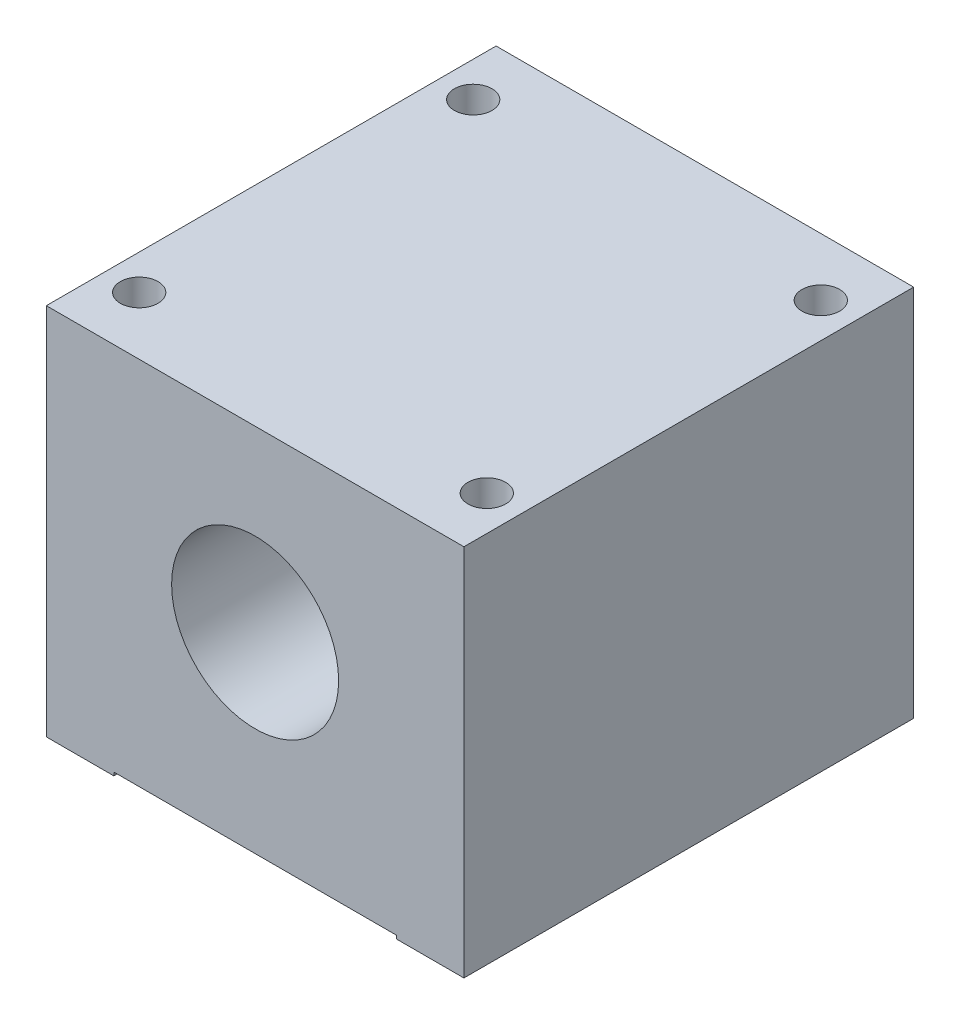
ISO-10303-21;
HEADER;
FILE_DESCRIPTION(('STEP AP214'),'2;1');
FILE_NAME('part.step','',(''),(''),'','','');
FILE_SCHEMA(('AUTOMOTIVE_DESIGN { 1 0 10303 214 1 1 1 1 }'));
ENDSEC;
DATA;
#1=APPLICATION_CONTEXT('core data for automotive mechanical design processes');
#2=APPLICATION_PROTOCOL_DEFINITION('international standard','automotive_design',2000,#1);
#3=PRODUCT_CONTEXT('',#1,'mechanical');
#4=PRODUCT('Part','Part','',(#3));
#5=PRODUCT_RELATED_PRODUCT_CATEGORY('part','',(#4));
#6=PRODUCT_DEFINITION_FORMATION('','',#4);
#7=PRODUCT_DEFINITION_CONTEXT('part definition',#1,'design');
#8=PRODUCT_DEFINITION('design','',#6,#7);
#9=PRODUCT_DEFINITION_SHAPE('','',#8);
#10=(LENGTH_UNIT() NAMED_UNIT(*) SI_UNIT(.MILLI.,.METRE.));
#11=(NAMED_UNIT(*) PLANE_ANGLE_UNIT() SI_UNIT($,.RADIAN.));
#12=(NAMED_UNIT(*) SI_UNIT($,.STERADIAN.) SOLID_ANGLE_UNIT());
#13=UNCERTAINTY_MEASURE_WITH_UNIT(LENGTH_MEASURE(1.E-05),#10,'distance_accuracy_value','');
#14=(GEOMETRIC_REPRESENTATION_CONTEXT(3) GLOBAL_UNCERTAINTY_ASSIGNED_CONTEXT((#13)) GLOBAL_UNIT_ASSIGNED_CONTEXT((#10,
#11,#12)) REPRESENTATION_CONTEXT('',''));
#15=CARTESIAN_POINT('',(0.,0.,0.));
#16=DIRECTION('',(0.,0.,1.));
#17=DIRECTION('',(1.,0.,0.));
#18=AXIS2_PLACEMENT_3D('',#15,#16,#17);
#19=CARTESIAN_POINT('',(0.,0.,0.));
#20=DIRECTION('',(0.,1.,0.));
#21=DIRECTION('',(0.,0.,1.));
#22=AXIS2_PLACEMENT_3D('',#19,#20,#21);
#23=PLANE('',#22);
#24=CARTESIAN_POINT('',(-26.8975,0.,6.78260869565217));
#25=DIRECTION('',(0.,1.,0.));
#26=DIRECTION('',(0.,0.,1.));
#27=AXIS2_PLACEMENT_3D('',#24,#25,#26);
#28=CIRCLE('',#27,2.15);
#29=CARTESIAN_POINT('',(-26.8975,0.,8.93260869565217));
#30=VERTEX_POINT('',#29);
#31=EDGE_CURVE('E172',#30,#30,#28,.T.);
#32=ORIENTED_EDGE('',*,*,#31,.T.);
#33=EDGE_LOOP('',(#32));
#34=FACE_BOUND('',#33,.T.);
#35=CARTESIAN_POINT('',(-26.8975,0.,-31.3173913043478));
#36=DIRECTION('',(0.,1.,0.));
#37=DIRECTION('',(0.,0.,1.));
#38=AXIS2_PLACEMENT_3D('',#35,#36,#37);
#39=CIRCLE('',#38,2.15);
#40=CARTESIAN_POINT('',(-26.8975,0.,-29.1673913043478));
#41=VERTEX_POINT('',#40);
#42=EDGE_CURVE('E184',#41,#41,#39,.T.);
#43=ORIENTED_EDGE('',*,*,#42,.T.);
#44=EDGE_LOOP('',(#43));
#45=FACE_BOUND('',#44,.T.);
#46=DIRECTION('',(1.,0.,0.));
#47=VECTOR('',#46,1.);
#48=CARTESIAN_POINT('',(-70.5375,0.,13.3826086956522));
#49=LINE('',#48,#47);
#50=CARTESIAN_POINT('',(-30.6075,0.,13.3826086956522));
#51=VERTEX_POINT('',#50);
#52=CARTESIAN_POINT('',(-22.9075,0.,13.3826086956522));
#53=VERTEX_POINT('',#52);
#54=EDGE_CURVE('E76',#51,#53,#49,.T.);
#55=ORIENTED_EDGE('',*,*,#54,.F.);
#56=DIRECTION('',(0.,0.,1.));
#57=VECTOR('',#56,1.);
#58=CARTESIAN_POINT('',(-30.6075,0.,17.1604271001959));
#59=LINE('',#58,#57);
#60=CARTESIAN_POINT('',(-30.6075,0.,-37.9173913043478));
#61=VERTEX_POINT('',#60);
#62=EDGE_CURVE('E108',#61,#51,#59,.T.);
#63=ORIENTED_EDGE('',*,*,#62,.F.);
#64=DIRECTION('',(-1.,0.,0.));
#65=VECTOR('',#64,1.);
#66=CARTESIAN_POINT('',(-70.5375,0.,-37.9173913043478));
#67=LINE('',#66,#65);
#68=CARTESIAN_POINT('',(-22.9075,0.,-37.9173913043478));
#69=VERTEX_POINT('',#68);
#70=EDGE_CURVE('E116',#69,#61,#67,.T.);
#71=ORIENTED_EDGE('',*,*,#70,.F.);
#72=DIRECTION('',(0.,0.,-1.));
#73=VECTOR('',#72,1.);
#74=CARTESIAN_POINT('',(-22.9075,0.,-37.9173913043478));
#75=LINE('',#74,#73);
#76=EDGE_CURVE('E128',#53,#69,#75,.T.);
#77=ORIENTED_EDGE('',*,*,#76,.F.);
#78=EDGE_LOOP('',(#55,#63,#71,#77));
#79=FACE_BOUND('',#78,.T.);
#80=ADVANCED_FACE('F32',(#34,#45,#79),#23,.F.);
#81=CARTESIAN_POINT('',(0.,42.6,0.));
#82=DIRECTION('',(0.,1.,0.));
#83=DIRECTION('',(0.,0.,1.));
#84=AXIS2_PLACEMENT_3D('',#81,#82,#83);
#85=PLANE('',#84);
#86=CARTESIAN_POINT('',(-66.5475,42.6,6.78260869565217));
#87=DIRECTION('',(0.,1.,0.));
#88=DIRECTION('',(0.,0.,1.));
#89=AXIS2_PLACEMENT_3D('',#86,#87,#88);
#90=CIRCLE('',#89,2.15);
#91=CARTESIAN_POINT('',(-66.5475,42.6,8.93260869565217));
#92=VERTEX_POINT('',#91);
#93=EDGE_CURVE('E181',#92,#92,#90,.T.);
#94=ORIENTED_EDGE('',*,*,#93,.F.);
#95=EDGE_LOOP('',(#94));
#96=FACE_BOUND('',#95,.T.);
#97=CARTESIAN_POINT('',(-66.5475,42.6,-31.3173913043478));
#98=DIRECTION('',(0.,1.,0.));
#99=DIRECTION('',(0.,0.,1.));
#100=AXIS2_PLACEMENT_3D('',#97,#98,#99);
#101=CIRCLE('',#100,2.15);
#102=CARTESIAN_POINT('',(-66.5475,42.6,-29.1673913043478));
#103=VERTEX_POINT('',#102);
#104=EDGE_CURVE('E193',#103,#103,#101,.T.);
#105=ORIENTED_EDGE('',*,*,#104,.F.);
#106=EDGE_LOOP('',(#105));
#107=FACE_BOUND('',#106,.T.);
#108=DIRECTION('',(0.,0.,-1.));
#109=VECTOR('',#108,1.);
#110=CARTESIAN_POINT('',(-22.9075,42.6,-37.9173913043478));
#111=LINE('',#110,#109);
#112=CARTESIAN_POINT('',(-22.9075,42.6,13.3826086956522));
#113=VERTEX_POINT('',#112);
#114=CARTESIAN_POINT('',(-22.9075,42.6,-37.9173913043478));
#115=VERTEX_POINT('',#114);
#116=EDGE_CURVE('E135',#113,#115,#111,.T.);
#117=ORIENTED_EDGE('',*,*,#116,.T.);
#118=DIRECTION('',(-1.,0.,0.));
#119=VECTOR('',#118,1.);
#120=CARTESIAN_POINT('',(-70.5375,42.6,-37.9173913043478));
#121=LINE('',#120,#119);
#122=CARTESIAN_POINT('',(-70.5375,42.6,-37.9173913043478));
#123=VERTEX_POINT('',#122);
#124=EDGE_CURVE('E84',#115,#123,#121,.T.);
#125=ORIENTED_EDGE('',*,*,#124,.T.);
#126=DIRECTION('',(0.,0.,1.));
#127=VECTOR('',#126,1.);
#128=CARTESIAN_POINT('',(-70.5375,42.6,-37.9173913043478));
#129=LINE('',#128,#127);
#130=CARTESIAN_POINT('',(-70.5375,42.6,13.3826086956522));
#131=VERTEX_POINT('',#130);
#132=EDGE_CURVE('E200',#123,#131,#129,.T.);
#133=ORIENTED_EDGE('',*,*,#132,.T.);
#134=DIRECTION('',(1.,0.,0.));
#135=VECTOR('',#134,1.);
#136=CARTESIAN_POINT('',(-70.5375,42.6,13.3826086956522));
#137=LINE('',#136,#135);
#138=EDGE_CURVE('E56',#131,#113,#137,.T.);
#139=ORIENTED_EDGE('',*,*,#138,.T.);
#140=EDGE_LOOP('',(#117,#125,#133,#139));
#141=FACE_BOUND('',#140,.T.);
#142=CARTESIAN_POINT('',(-26.8975,42.6,-31.3173913043478));
#143=DIRECTION('',(0.,1.,0.));
#144=DIRECTION('',(0.,0.,1.));
#145=AXIS2_PLACEMENT_3D('',#142,#143,#144);
#146=CIRCLE('',#145,2.15);
#147=CARTESIAN_POINT('',(-26.8975,42.6,-29.1673913043478));
#148=VERTEX_POINT('',#147);
#149=EDGE_CURVE('E187',#148,#148,#146,.T.);
#150=ORIENTED_EDGE('',*,*,#149,.F.);
#151=EDGE_LOOP('',(#150));
#152=FACE_BOUND('',#151,.T.);
#153=CARTESIAN_POINT('',(-26.8975,42.6,6.78260869565217));
#154=DIRECTION('',(0.,1.,0.));
#155=DIRECTION('',(0.,0.,1.));
#156=AXIS2_PLACEMENT_3D('',#153,#154,#155);
#157=CIRCLE('',#156,2.15);
#158=CARTESIAN_POINT('',(-26.8975,42.6,8.93260869565217));
#159=VERTEX_POINT('',#158);
#160=EDGE_CURVE('E175',#159,#159,#157,.T.);
#161=ORIENTED_EDGE('',*,*,#160,.F.);
#162=EDGE_LOOP('',(#161));
#163=FACE_BOUND('',#162,.T.);
#164=ADVANCED_FACE('F203',(#96,#107,#141,#152,#163),#85,.T.);
#165=CARTESIAN_POINT('',(-62.8375,0.,-37.9173913043478));
#166=VERTEX_POINT('',#165);
#167=CARTESIAN_POINT('',(-70.5375,0.,-37.9173913043478));
#168=VERTEX_POINT('',#167);
#169=EDGE_CURVE('E125',#166,#168,#67,.T.);
#170=ORIENTED_EDGE('',*,*,#169,.F.);
#171=DIRECTION('',(0.,0.,-1.));
#172=VECTOR('',#171,1.);
#173=CARTESIAN_POINT('',(-62.8375,0.,17.1604271001959));
#174=LINE('',#173,#172);
#175=CARTESIAN_POINT('',(-62.8375,0.,13.3826086956522));
#176=VERTEX_POINT('',#175);
#177=EDGE_CURVE('E117',#176,#166,#174,.T.);
#178=ORIENTED_EDGE('',*,*,#177,.F.);
#179=CARTESIAN_POINT('',(-70.5375,0.,13.3826086956522));
#180=VERTEX_POINT('',#179);
#181=EDGE_CURVE('E132',#180,#176,#49,.T.);
#182=ORIENTED_EDGE('',*,*,#181,.F.);
#183=DIRECTION('',(0.,0.,1.));
#184=VECTOR('',#183,1.);
#185=CARTESIAN_POINT('',(-70.5375,0.,-37.9173913043478));
#186=LINE('',#185,#184);
#187=EDGE_CURVE('E124',#168,#180,#186,.T.);
#188=ORIENTED_EDGE('',*,*,#187,.F.);
#189=EDGE_LOOP('',(#170,#178,#182,#188));
#190=FACE_BOUND('',#189,.T.);
#191=CARTESIAN_POINT('',(-66.5475,0.,-31.3173913043478));
#192=DIRECTION('',(0.,1.,0.));
#193=DIRECTION('',(0.,0.,1.));
#194=AXIS2_PLACEMENT_3D('',#191,#192,#193);
#195=CIRCLE('',#194,2.15);
#196=CARTESIAN_POINT('',(-66.5475,0.,-29.1673913043478));
#197=VERTEX_POINT('',#196);
#198=EDGE_CURVE('E190',#197,#197,#195,.T.);
#199=ORIENTED_EDGE('',*,*,#198,.T.);
#200=EDGE_LOOP('',(#199));
#201=FACE_BOUND('',#200,.T.);
#202=CARTESIAN_POINT('',(-66.5475,0.,6.78260869565217));
#203=DIRECTION('',(0.,1.,0.));
#204=DIRECTION('',(0.,0.,1.));
#205=AXIS2_PLACEMENT_3D('',#202,#203,#204);
#206=CIRCLE('',#205,2.15);
#207=CARTESIAN_POINT('',(-66.5475,0.,8.93260869565217));
#208=VERTEX_POINT('',#207);
#209=EDGE_CURVE('E178',#208,#208,#206,.T.);
#210=ORIENTED_EDGE('',*,*,#209,.T.);
#211=EDGE_LOOP('',(#210));
#212=FACE_BOUND('',#211,.T.);
#213=ADVANCED_FACE('F159',(#190,#201,#212),#23,.F.);
#214=CARTESIAN_POINT('',(-22.9075,42.6,-37.9173913043478));
#215=DIRECTION('',(-1.,0.,0.));
#216=DIRECTION('',(0.,0.,1.));
#217=AXIS2_PLACEMENT_3D('',#214,#215,#216);
#218=PLANE('',#217);
#219=ORIENTED_EDGE('',*,*,#76,.T.);
#220=DIRECTION('',(0.,-1.,0.));
#221=VECTOR('',#220,1.);
#222=CARTESIAN_POINT('',(-22.9075,42.6,-37.9173913043478));
#223=LINE('',#222,#221);
#224=EDGE_CURVE('E122',#115,#69,#223,.T.);
#225=ORIENTED_EDGE('',*,*,#224,.F.);
#226=ORIENTED_EDGE('',*,*,#116,.F.);
#227=DIRECTION('',(0.,-1.,0.));
#228=VECTOR('',#227,1.);
#229=CARTESIAN_POINT('',(-22.9075,42.6,13.3826086956522));
#230=LINE('',#229,#228);
#231=EDGE_CURVE('E136',#113,#53,#230,.T.);
#232=ORIENTED_EDGE('',*,*,#231,.T.);
#233=EDGE_LOOP('',(#219,#225,#226,#232));
#234=FACE_BOUND('',#233,.T.);
#235=ADVANCED_FACE('F34',(#234),#218,.F.);
#236=CARTESIAN_POINT('',(-70.5375,42.6,-37.9173913043478));
#237=DIRECTION('',(0.,0.,1.));
#238=DIRECTION('',(1.,0.,0.));
#239=AXIS2_PLACEMENT_3D('',#236,#237,#238);
#240=PLANE('',#239);
#241=ORIENTED_EDGE('',*,*,#70,.T.);
#242=DIRECTION('',(0.,1.,0.));
#243=VECTOR('',#242,1.);
#244=CARTESIAN_POINT('',(-30.6075,42.6,-37.9173913043478));
#245=LINE('',#244,#243);
#246=CARTESIAN_POINT('',(-30.6075,0.38,-37.9173913043478));
#247=VERTEX_POINT('',#246);
#248=EDGE_CURVE('E105',#61,#247,#245,.T.);
#249=ORIENTED_EDGE('',*,*,#248,.T.);
#250=DIRECTION('',(1.,0.,0.));
#251=VECTOR('',#250,1.);
#252=CARTESIAN_POINT('',(-70.5375,0.379999999999998,-37.9173913043478));
#253=LINE('',#252,#251);
#254=CARTESIAN_POINT('',(-62.8375,0.38,-37.9173913043478));
#255=VERTEX_POINT('',#254);
#256=EDGE_CURVE('E166',#255,#247,#253,.T.);
#257=ORIENTED_EDGE('',*,*,#256,.F.);
#258=DIRECTION('',(0.,-1.,0.));
#259=VECTOR('',#258,1.);
#260=CARTESIAN_POINT('',(-62.8375,42.6,-37.9173913043478));
#261=LINE('',#260,#259);
#262=EDGE_CURVE('E112',#255,#166,#261,.T.);
#263=ORIENTED_EDGE('',*,*,#262,.T.);
#264=ORIENTED_EDGE('',*,*,#169,.T.);
#265=DIRECTION('',(0.,-1.,0.));
#266=VECTOR('',#265,1.);
#267=CARTESIAN_POINT('',(-70.5375,42.6,-37.9173913043478));
#268=LINE('',#267,#266);
#269=EDGE_CURVE('E141',#123,#168,#268,.T.);
#270=ORIENTED_EDGE('',*,*,#269,.F.);
#271=ORIENTED_EDGE('',*,*,#124,.F.);
#272=ORIENTED_EDGE('',*,*,#224,.T.);
#273=EDGE_LOOP('',(#241,#249,#257,#263,#264,#270,#271,#272));
#274=FACE_BOUND('',#273,.T.);
#275=CARTESIAN_POINT('',(-46.7225,22.23,-37.9173913043478));
#276=DIRECTION('',(0.,0.,1.));
#277=DIRECTION('',(1.,0.,0.));
#278=AXIS2_PLACEMENT_3D('',#275,#276,#277);
#279=CIRCLE('',#278,9.525);
#280=CARTESIAN_POINT('',(-37.1975,22.23,-37.9173913043478));
#281=VERTEX_POINT('',#280);
#282=EDGE_CURVE('E169',#281,#281,#279,.T.);
#283=ORIENTED_EDGE('',*,*,#282,.T.);
#284=EDGE_LOOP('',(#283));
#285=FACE_BOUND('',#284,.T.);
#286=ADVANCED_FACE('F119',(#274,#285),#240,.F.);
#287=CARTESIAN_POINT('',(-70.5375,42.6,-37.9173913043478));
#288=DIRECTION('',(1.,0.,0.));
#289=DIRECTION('',(0.,0.,-1.));
#290=AXIS2_PLACEMENT_3D('',#287,#288,#289);
#291=PLANE('',#290);
#292=ORIENTED_EDGE('',*,*,#187,.T.);
#293=DIRECTION('',(0.,-1.,0.));
#294=VECTOR('',#293,1.);
#295=CARTESIAN_POINT('',(-70.5375,42.6,13.3826086956522));
#296=LINE('',#295,#294);
#297=EDGE_CURVE('E138',#131,#180,#296,.T.);
#298=ORIENTED_EDGE('',*,*,#297,.F.);
#299=ORIENTED_EDGE('',*,*,#132,.F.);
#300=ORIENTED_EDGE('',*,*,#269,.T.);
#301=EDGE_LOOP('',(#292,#298,#299,#300));
#302=FACE_BOUND('',#301,.T.);
#303=ADVANCED_FACE('F206',(#302),#291,.F.);
#304=CARTESIAN_POINT('',(-70.5375,42.6,13.3826086956522));
#305=DIRECTION('',(0.,0.,-1.));
#306=DIRECTION('',(-1.,0.,0.));
#307=AXIS2_PLACEMENT_3D('',#304,#305,#306);
#308=PLANE('',#307);
#309=CARTESIAN_POINT('',(-46.7225,22.23,13.3826086956522));
#310=DIRECTION('',(0.,0.,1.));
#311=DIRECTION('',(1.,0.,0.));
#312=AXIS2_PLACEMENT_3D('',#309,#310,#311);
#313=CIRCLE('',#312,9.525);
#314=CARTESIAN_POINT('',(-37.1975,22.23,13.3826086956522));
#315=VERTEX_POINT('',#314);
#316=EDGE_CURVE('E111',#315,#315,#313,.T.);
#317=ORIENTED_EDGE('',*,*,#316,.F.);
#318=EDGE_LOOP('',(#317));
#319=FACE_BOUND('',#318,.T.);
#320=DIRECTION('',(-1.,0.,0.));
#321=VECTOR('',#320,1.);
#322=CARTESIAN_POINT('',(-70.5375,0.379999999999998,13.3826086956522));
#323=LINE('',#322,#321);
#324=CARTESIAN_POINT('',(-30.6075,0.379999999999998,13.3826086956522));
#325=VERTEX_POINT('',#324);
#326=CARTESIAN_POINT('',(-62.8375,0.38,13.3826086956522));
#327=VERTEX_POINT('',#326);
#328=EDGE_CURVE('E145',#325,#327,#323,.T.);
#329=ORIENTED_EDGE('',*,*,#328,.F.);
#330=DIRECTION('',(0.,-1.,0.));
#331=VECTOR('',#330,1.);
#332=CARTESIAN_POINT('',(-30.6075,42.6,13.3826086956522));
#333=LINE('',#332,#331);
#334=EDGE_CURVE('E11',#325,#51,#333,.T.);
#335=ORIENTED_EDGE('',*,*,#334,.T.);
#336=ORIENTED_EDGE('',*,*,#54,.T.);
#337=ORIENTED_EDGE('',*,*,#231,.F.);
#338=ORIENTED_EDGE('',*,*,#138,.F.);
#339=ORIENTED_EDGE('',*,*,#297,.T.);
#340=ORIENTED_EDGE('',*,*,#181,.T.);
#341=DIRECTION('',(0.,1.,0.));
#342=VECTOR('',#341,1.);
#343=CARTESIAN_POINT('',(-62.8375,42.6,13.3826086956522));
#344=LINE('',#343,#342);
#345=EDGE_CURVE('E40',#176,#327,#344,.T.);
#346=ORIENTED_EDGE('',*,*,#345,.T.);
#347=EDGE_LOOP('',(#329,#335,#336,#337,#338,#339,#340,#346));
#348=FACE_BOUND('',#347,.T.);
#349=ADVANCED_FACE('F148',(#319,#348),#308,.F.);
#350=CARTESIAN_POINT('',(-66.5475,42.6,-31.3173913043478));
#351=DIRECTION('',(0.,-1.,0.));
#352=DIRECTION('',(0.,0.,-1.));
#353=AXIS2_PLACEMENT_3D('',#350,#351,#352);
#354=CYLINDRICAL_SURFACE('',#353,2.15);
#355=ORIENTED_EDGE('',*,*,#104,.T.);
#356=EDGE_LOOP('',(#355));
#357=FACE_BOUND('',#356,.T.);
#358=ORIENTED_EDGE('',*,*,#198,.F.);
#359=EDGE_LOOP('',(#358));
#360=FACE_BOUND('',#359,.T.);
#361=ADVANCED_FACE('F227',(#357,#360),#354,.F.);
#362=CARTESIAN_POINT('',(-26.8975,42.6,-31.3173913043478));
#363=DIRECTION('',(0.,-1.,0.));
#364=DIRECTION('',(0.,0.,-1.));
#365=AXIS2_PLACEMENT_3D('',#362,#363,#364);
#366=CYLINDRICAL_SURFACE('',#365,2.15);
#367=ORIENTED_EDGE('',*,*,#149,.T.);
#368=EDGE_LOOP('',(#367));
#369=FACE_BOUND('',#368,.T.);
#370=ORIENTED_EDGE('',*,*,#42,.F.);
#371=EDGE_LOOP('',(#370));
#372=FACE_BOUND('',#371,.T.);
#373=ADVANCED_FACE('F245',(#369,#372),#366,.F.);
#374=CARTESIAN_POINT('',(-66.5475,42.6,6.78260869565217));
#375=DIRECTION('',(0.,-1.,0.));
#376=DIRECTION('',(0.,0.,-1.));
#377=AXIS2_PLACEMENT_3D('',#374,#375,#376);
#378=CYLINDRICAL_SURFACE('',#377,2.15);
#379=ORIENTED_EDGE('',*,*,#93,.T.);
#380=EDGE_LOOP('',(#379));
#381=FACE_BOUND('',#380,.T.);
#382=ORIENTED_EDGE('',*,*,#209,.F.);
#383=EDGE_LOOP('',(#382));
#384=FACE_BOUND('',#383,.T.);
#385=ADVANCED_FACE('F252',(#381,#384),#378,.F.);
#386=CARTESIAN_POINT('',(-26.8975,42.6,6.78260869565217));
#387=DIRECTION('',(0.,-1.,0.));
#388=DIRECTION('',(0.,0.,-1.));
#389=AXIS2_PLACEMENT_3D('',#386,#387,#388);
#390=CYLINDRICAL_SURFACE('',#389,2.15);
#391=ORIENTED_EDGE('',*,*,#160,.T.);
#392=EDGE_LOOP('',(#391));
#393=FACE_BOUND('',#392,.T.);
#394=ORIENTED_EDGE('',*,*,#31,.F.);
#395=EDGE_LOOP('',(#394));
#396=FACE_BOUND('',#395,.T.);
#397=ADVANCED_FACE('F260',(#393,#396),#390,.F.);
#398=CARTESIAN_POINT('',(-46.7225,22.23,-37.9173913043478));
#399=DIRECTION('',(0.,0.,1.));
#400=DIRECTION('',(1.,0.,0.));
#401=AXIS2_PLACEMENT_3D('',#398,#399,#400);
#402=CYLINDRICAL_SURFACE('',#401,9.525);
#403=ORIENTED_EDGE('',*,*,#282,.F.);
#404=EDGE_LOOP('',(#403));
#405=FACE_BOUND('',#404,.T.);
#406=ORIENTED_EDGE('',*,*,#316,.T.);
#407=EDGE_LOOP('',(#406));
#408=FACE_BOUND('',#407,.T.);
#409=ADVANCED_FACE('F268',(#405,#408),#402,.F.);
#410=CARTESIAN_POINT('',(-30.6075,0.38,17.1604271001959));
#411=DIRECTION('',(1.,0.,0.));
#412=DIRECTION('',(0.,0.,-1.));
#413=AXIS2_PLACEMENT_3D('',#410,#411,#412);
#414=PLANE('',#413);
#415=ORIENTED_EDGE('',*,*,#62,.T.);
#416=ORIENTED_EDGE('',*,*,#334,.F.);
#417=DIRECTION('',(0.,0.,1.));
#418=VECTOR('',#417,1.);
#419=CARTESIAN_POINT('',(-30.6075,0.38,17.1604271001959));
#420=LINE('',#419,#418);
#421=EDGE_CURVE('E47',#247,#325,#420,.T.);
#422=ORIENTED_EDGE('',*,*,#421,.F.);
#423=ORIENTED_EDGE('',*,*,#248,.F.);
#424=EDGE_LOOP('',(#415,#416,#422,#423));
#425=FACE_BOUND('',#424,.T.);
#426=ADVANCED_FACE('F107',(#425),#414,.F.);
#427=CARTESIAN_POINT('',(-62.8375,0.38,17.1604271001959));
#428=DIRECTION('',(-1.,0.,0.));
#429=DIRECTION('',(0.,0.,1.));
#430=AXIS2_PLACEMENT_3D('',#427,#428,#429);
#431=PLANE('',#430);
#432=DIRECTION('',(0.,0.,-1.));
#433=VECTOR('',#432,1.);
#434=CARTESIAN_POINT('',(-62.8375,0.38,17.1604271001959));
#435=LINE('',#434,#433);
#436=EDGE_CURVE('E156',#327,#255,#435,.T.);
#437=ORIENTED_EDGE('',*,*,#436,.F.);
#438=ORIENTED_EDGE('',*,*,#345,.F.);
#439=ORIENTED_EDGE('',*,*,#177,.T.);
#440=ORIENTED_EDGE('',*,*,#262,.F.);
#441=EDGE_LOOP('',(#437,#438,#439,#440));
#442=FACE_BOUND('',#441,.T.);
#443=ADVANCED_FACE('F153',(#442),#431,.F.);
#444=CARTESIAN_POINT('',(0.,0.38,0.));
#445=DIRECTION('',(0.,-1.,0.));
#446=DIRECTION('',(0.,0.,-1.));
#447=AXIS2_PLACEMENT_3D('',#444,#445,#446);
#448=PLANE('',#447);
#449=ORIENTED_EDGE('',*,*,#256,.T.);
#450=ORIENTED_EDGE('',*,*,#421,.T.);
#451=ORIENTED_EDGE('',*,*,#328,.T.);
#452=ORIENTED_EDGE('',*,*,#436,.T.);
#453=EDGE_LOOP('',(#449,#450,#451,#452));
#454=FACE_BOUND('',#453,.T.);
#455=ADVANCED_FACE('F288',(#454),#448,.T.);
#456=CLOSED_SHELL('',(#80,#164,#213,#235,#286,#303,#349,#361,#373,#385,#397,#409,#426,#443,#455));
#457=MANIFOLD_SOLID_BREP('B2',#456);
#458=ADVANCED_BREP_SHAPE_REPRESENTATION('',(#18,#457),#14);
#459=SHAPE_DEFINITION_REPRESENTATION(#9,#458);
ENDSEC;
END-ISO-10303-21;
